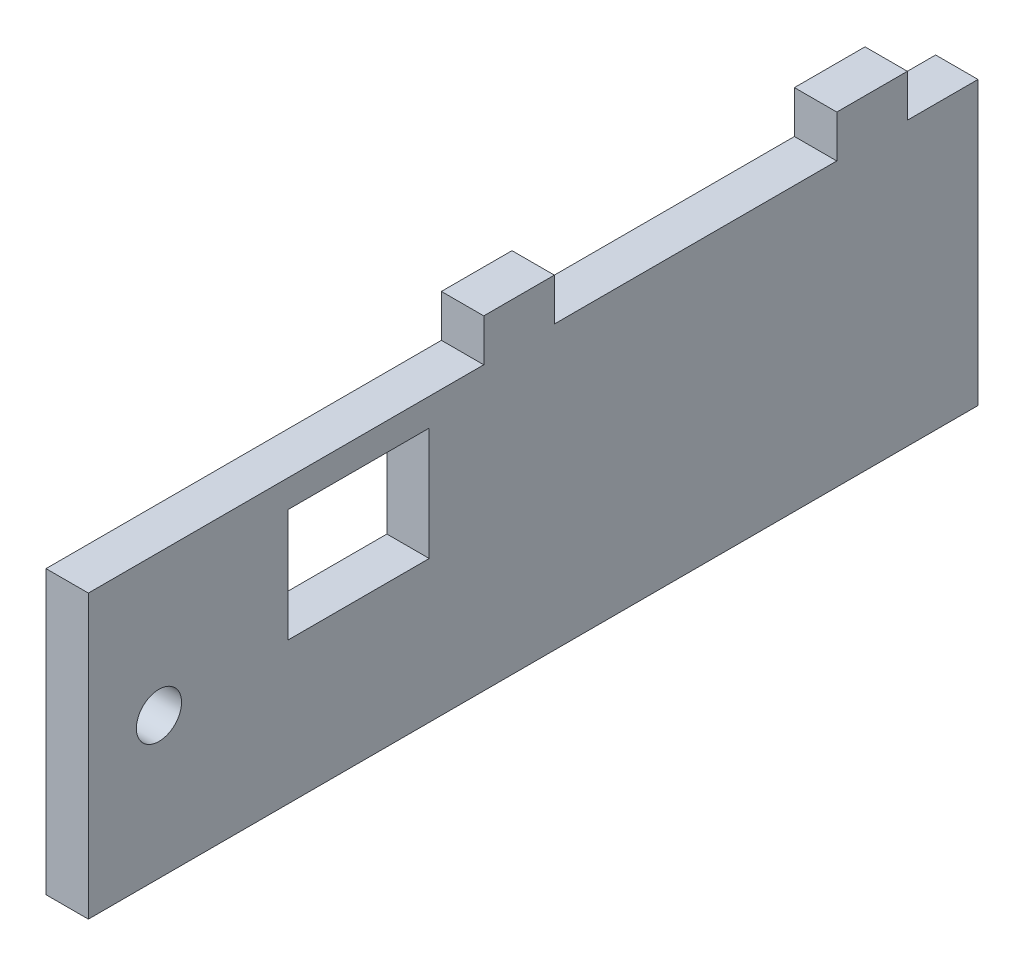
ISO-10303-21;
HEADER;
FILE_DESCRIPTION(('STEP AP214'),'2;1');
FILE_NAME('part.step','',(''),(''),'','','');
FILE_SCHEMA(('AUTOMOTIVE_DESIGN { 1 0 10303 214 1 1 1 1 }'));
ENDSEC;
DATA;
#1=APPLICATION_CONTEXT('core data for automotive mechanical design processes');
#2=APPLICATION_PROTOCOL_DEFINITION('international standard','automotive_design',2000,#1);
#3=PRODUCT_CONTEXT('',#1,'mechanical');
#4=PRODUCT('Part','Part','',(#3));
#5=PRODUCT_RELATED_PRODUCT_CATEGORY('part','',(#4));
#6=PRODUCT_DEFINITION_FORMATION('','',#4);
#7=PRODUCT_DEFINITION_CONTEXT('part definition',#1,'design');
#8=PRODUCT_DEFINITION('design','',#6,#7);
#9=PRODUCT_DEFINITION_SHAPE('','',#8);
#10=(LENGTH_UNIT() NAMED_UNIT(*) SI_UNIT(.MILLI.,.METRE.));
#11=(NAMED_UNIT(*) PLANE_ANGLE_UNIT() SI_UNIT($,.RADIAN.));
#12=(NAMED_UNIT(*) SI_UNIT($,.STERADIAN.) SOLID_ANGLE_UNIT());
#13=UNCERTAINTY_MEASURE_WITH_UNIT(LENGTH_MEASURE(1.E-05),#10,'distance_accuracy_value','');
#14=(GEOMETRIC_REPRESENTATION_CONTEXT(3) GLOBAL_UNCERTAINTY_ASSIGNED_CONTEXT((#13)) GLOBAL_UNIT_ASSIGNED_CONTEXT((#10,
#11,#12)) REPRESENTATION_CONTEXT('',''));
#15=CARTESIAN_POINT('',(0.,0.,0.));
#16=DIRECTION('',(0.,0.,1.));
#17=DIRECTION('',(1.,0.,0.));
#18=AXIS2_PLACEMENT_3D('',#15,#16,#17);
#19=CARTESIAN_POINT('',(3.,0.,0.));
#20=DIRECTION('',(-1.,0.,0.));
#21=DIRECTION('',(0.,0.,1.));
#22=AXIS2_PLACEMENT_3D('',#19,#20,#21);
#23=PLANE('',#22);
#24=CARTESIAN_POINT('',(3.,17.,-21.9999999999995));
#25=DIRECTION('',(1.,0.,0.));
#26=DIRECTION('',(0.,0.,-1.));
#27=AXIS2_PLACEMENT_3D('',#24,#25,#26);
#28=CIRCLE('',#27,1.59999999999971);
#29=CARTESIAN_POINT('',(3.,17.,-23.5999999999993));
#30=VERTEX_POINT('',#29);
#31=EDGE_CURVE('E182',#30,#30,#28,.T.);
#32=ORIENTED_EDGE('',*,*,#31,.F.);
#33=EDGE_LOOP('',(#32));
#34=FACE_BOUND('',#33,.T.);
#35=DIRECTION('',(0.,0.,-1.));
#36=VECTOR('',#35,1.);
#37=CARTESIAN_POINT('',(3.,7.,-17.));
#38=LINE('',#37,#36);
#39=CARTESIAN_POINT('',(3.,7.,-17.));
#40=VERTEX_POINT('',#39);
#41=CARTESIAN_POINT('',(3.,7.,-80.));
#42=VERTEX_POINT('',#41);
#43=EDGE_CURVE('E188',#40,#42,#38,.T.);
#44=ORIENTED_EDGE('',*,*,#43,.T.);
#45=DIRECTION('',(0.,1.,0.));
#46=VECTOR('',#45,1.);
#47=CARTESIAN_POINT('',(3.,27.,-80.));
#48=LINE('',#47,#46);
#49=CARTESIAN_POINT('',(3.,27.,-80.));
#50=VERTEX_POINT('',#49);
#51=EDGE_CURVE('E191',#42,#50,#48,.T.);
#52=ORIENTED_EDGE('',*,*,#51,.T.);
#53=DIRECTION('',(0.,0.,1.));
#54=VECTOR('',#53,1.);
#55=CARTESIAN_POINT('',(3.,27.,-75.));
#56=LINE('',#55,#54);
#57=CARTESIAN_POINT('',(3.,27.,-75.));
#58=VERTEX_POINT('',#57);
#59=EDGE_CURVE('E194',#50,#58,#56,.T.);
#60=ORIENTED_EDGE('',*,*,#59,.T.);
#61=DIRECTION('',(0.,1.,0.));
#62=VECTOR('',#61,1.);
#63=CARTESIAN_POINT('',(3.,30.,-75.));
#64=LINE('',#63,#62);
#65=CARTESIAN_POINT('',(3.,30.,-75.));
#66=VERTEX_POINT('',#65);
#67=EDGE_CURVE('E196',#58,#66,#64,.T.);
#68=ORIENTED_EDGE('',*,*,#67,.T.);
#69=DIRECTION('',(0.,0.,1.));
#70=VECTOR('',#69,1.);
#71=CARTESIAN_POINT('',(3.,30.,-70.));
#72=LINE('',#71,#70);
#73=CARTESIAN_POINT('',(3.,30.,-70.));
#74=VERTEX_POINT('',#73);
#75=EDGE_CURVE('E198',#66,#74,#72,.T.);
#76=ORIENTED_EDGE('',*,*,#75,.T.);
#77=DIRECTION('',(0.,-1.,0.));
#78=VECTOR('',#77,1.);
#79=CARTESIAN_POINT('',(3.,27.,-70.));
#80=LINE('',#79,#78);
#81=CARTESIAN_POINT('',(3.,27.,-70.));
#82=VERTEX_POINT('',#81);
#83=EDGE_CURVE('E200',#74,#82,#80,.T.);
#84=ORIENTED_EDGE('',*,*,#83,.T.);
#85=DIRECTION('',(0.,0.,1.));
#86=VECTOR('',#85,1.);
#87=CARTESIAN_POINT('',(3.,27.,-50.));
#88=LINE('',#87,#86);
#89=CARTESIAN_POINT('',(3.,27.,-50.));
#90=VERTEX_POINT('',#89);
#91=EDGE_CURVE('E202',#82,#90,#88,.T.);
#92=ORIENTED_EDGE('',*,*,#91,.T.);
#93=DIRECTION('',(0.,1.,0.));
#94=VECTOR('',#93,1.);
#95=CARTESIAN_POINT('',(3.,30.,-50.));
#96=LINE('',#95,#94);
#97=CARTESIAN_POINT('',(3.,30.,-50.));
#98=VERTEX_POINT('',#97);
#99=EDGE_CURVE('E204',#90,#98,#96,.T.);
#100=ORIENTED_EDGE('',*,*,#99,.T.);
#101=DIRECTION('',(0.,0.,1.));
#102=VECTOR('',#101,1.);
#103=CARTESIAN_POINT('',(3.,30.,-45.));
#104=LINE('',#103,#102);
#105=CARTESIAN_POINT('',(3.,30.,-45.));
#106=VERTEX_POINT('',#105);
#107=EDGE_CURVE('E206',#98,#106,#104,.T.);
#108=ORIENTED_EDGE('',*,*,#107,.T.);
#109=DIRECTION('',(0.,-1.,0.));
#110=VECTOR('',#109,1.);
#111=CARTESIAN_POINT('',(3.,27.,-45.));
#112=LINE('',#111,#110);
#113=CARTESIAN_POINT('',(3.,27.,-45.));
#114=VERTEX_POINT('',#113);
#115=EDGE_CURVE('E208',#106,#114,#112,.T.);
#116=ORIENTED_EDGE('',*,*,#115,.T.);
#117=DIRECTION('',(0.,0.,1.));
#118=VECTOR('',#117,1.);
#119=CARTESIAN_POINT('',(3.,27.,-17.));
#120=LINE('',#119,#118);
#121=CARTESIAN_POINT('',(3.,27.,-17.));
#122=VERTEX_POINT('',#121);
#123=EDGE_CURVE('E210',#114,#122,#120,.T.);
#124=ORIENTED_EDGE('',*,*,#123,.T.);
#125=DIRECTION('',(0.,-1.,0.));
#126=VECTOR('',#125,1.);
#127=CARTESIAN_POINT('',(3.,27.,-17.));
#128=LINE('',#127,#126);
#129=EDGE_CURVE('E212',#122,#40,#128,.T.);
#130=ORIENTED_EDGE('',*,*,#129,.T.);
#131=EDGE_LOOP('',(#44,#52,#60,#68,#76,#84,#92,#100,#108,#116,#124,#130));
#132=FACE_BOUND('',#131,.T.);
#133=DIRECTION('',(0.,1.,0.));
#134=VECTOR('',#133,1.);
#135=CARTESIAN_POINT('',(3.,25.05,-41.1399999999998));
#136=LINE('',#135,#134);
#137=CARTESIAN_POINT('',(3.,17.05,-41.1399999999998));
#138=VERTEX_POINT('',#137);
#139=CARTESIAN_POINT('',(3.,25.05,-41.1399999999998));
#140=VERTEX_POINT('',#139);
#141=EDGE_CURVE('E146',#138,#140,#136,.T.);
#142=ORIENTED_EDGE('',*,*,#141,.F.);
#143=DIRECTION('',(0.,0.,-1.));
#144=VECTOR('',#143,1.);
#145=CARTESIAN_POINT('',(3.,17.05,-41.1399999999998));
#146=LINE('',#145,#144);
#147=CARTESIAN_POINT('',(3.,17.05,-31.1399999999998));
#148=VERTEX_POINT('',#147);
#149=EDGE_CURVE('E168',#148,#138,#146,.T.);
#150=ORIENTED_EDGE('',*,*,#149,.F.);
#151=DIRECTION('',(0.,-1.,0.));
#152=VECTOR('',#151,1.);
#153=CARTESIAN_POINT('',(3.,25.05,-31.1399999999998));
#154=LINE('',#153,#152);
#155=CARTESIAN_POINT('',(3.,25.05,-31.1399999999998));
#156=VERTEX_POINT('',#155);
#157=EDGE_CURVE('E166',#156,#148,#154,.T.);
#158=ORIENTED_EDGE('',*,*,#157,.F.);
#159=DIRECTION('',(0.,0.,1.));
#160=VECTOR('',#159,1.);
#161=CARTESIAN_POINT('',(3.,25.05,-41.1399999999998));
#162=LINE('',#161,#160);
#163=EDGE_CURVE('E154',#140,#156,#162,.T.);
#164=ORIENTED_EDGE('',*,*,#163,.F.);
#165=EDGE_LOOP('',(#142,#150,#158,#164));
#166=FACE_BOUND('',#165,.T.);
#167=ADVANCED_FACE('F33',(#34,#132,#166),#23,.F.);
#168=CARTESIAN_POINT('',(0.,0.,0.));
#169=DIRECTION('',(-1.,0.,0.));
#170=DIRECTION('',(0.,0.,1.));
#171=AXIS2_PLACEMENT_3D('',#168,#169,#170);
#172=PLANE('',#171);
#173=CARTESIAN_POINT('',(0.,17.,-21.9999999999995));
#174=DIRECTION('',(1.,0.,0.));
#175=DIRECTION('',(0.,0.,-1.));
#176=AXIS2_PLACEMENT_3D('',#173,#174,#175);
#177=CIRCLE('',#176,1.59999999999971);
#178=CARTESIAN_POINT('',(0.,17.,-23.5999999999993));
#179=VERTEX_POINT('',#178);
#180=EDGE_CURVE('E162',#179,#179,#177,.T.);
#181=ORIENTED_EDGE('',*,*,#180,.T.);
#182=EDGE_LOOP('',(#181));
#183=FACE_BOUND('',#182,.T.);
#184=DIRECTION('',(0.,0.,-1.));
#185=VECTOR('',#184,1.);
#186=CARTESIAN_POINT('',(0.,7.,-17.));
#187=LINE('',#186,#185);
#188=CARTESIAN_POINT('',(0.,7.,-17.));
#189=VERTEX_POINT('',#188);
#190=CARTESIAN_POINT('',(0.,7.,-80.));
#191=VERTEX_POINT('',#190);
#192=EDGE_CURVE('E185',#189,#191,#187,.T.);
#193=ORIENTED_EDGE('',*,*,#192,.F.);
#194=DIRECTION('',(0.,-1.,0.));
#195=VECTOR('',#194,1.);
#196=CARTESIAN_POINT('',(0.,27.,-17.));
#197=LINE('',#196,#195);
#198=CARTESIAN_POINT('',(0.,27.,-17.));
#199=VERTEX_POINT('',#198);
#200=EDGE_CURVE('E192',#199,#189,#197,.T.);
#201=ORIENTED_EDGE('',*,*,#200,.F.);
#202=DIRECTION('',(0.,0.,1.));
#203=VECTOR('',#202,1.);
#204=CARTESIAN_POINT('',(0.,27.,-17.));
#205=LINE('',#204,#203);
#206=CARTESIAN_POINT('',(0.,27.,-45.));
#207=VERTEX_POINT('',#206);
#208=EDGE_CURVE('E235',#207,#199,#205,.T.);
#209=ORIENTED_EDGE('',*,*,#208,.F.);
#210=DIRECTION('',(0.,-1.,0.));
#211=VECTOR('',#210,1.);
#212=CARTESIAN_POINT('',(0.,27.,-45.));
#213=LINE('',#212,#211);
#214=CARTESIAN_POINT('',(0.,30.,-45.));
#215=VERTEX_POINT('',#214);
#216=EDGE_CURVE('E233',#215,#207,#213,.T.);
#217=ORIENTED_EDGE('',*,*,#216,.F.);
#218=DIRECTION('',(0.,0.,1.));
#219=VECTOR('',#218,1.);
#220=CARTESIAN_POINT('',(0.,30.,-45.));
#221=LINE('',#220,#219);
#222=CARTESIAN_POINT('',(0.,30.,-50.));
#223=VERTEX_POINT('',#222);
#224=EDGE_CURVE('E231',#223,#215,#221,.T.);
#225=ORIENTED_EDGE('',*,*,#224,.F.);
#226=DIRECTION('',(0.,1.,0.));
#227=VECTOR('',#226,1.);
#228=CARTESIAN_POINT('',(0.,30.,-50.));
#229=LINE('',#228,#227);
#230=CARTESIAN_POINT('',(0.,27.,-50.));
#231=VERTEX_POINT('',#230);
#232=EDGE_CURVE('E229',#231,#223,#229,.T.);
#233=ORIENTED_EDGE('',*,*,#232,.F.);
#234=DIRECTION('',(0.,0.,1.));
#235=VECTOR('',#234,1.);
#236=CARTESIAN_POINT('',(0.,27.,-50.));
#237=LINE('',#236,#235);
#238=CARTESIAN_POINT('',(0.,27.,-70.));
#239=VERTEX_POINT('',#238);
#240=EDGE_CURVE('E227',#239,#231,#237,.T.);
#241=ORIENTED_EDGE('',*,*,#240,.F.);
#242=DIRECTION('',(0.,-1.,0.));
#243=VECTOR('',#242,1.);
#244=CARTESIAN_POINT('',(0.,27.,-70.));
#245=LINE('',#244,#243);
#246=CARTESIAN_POINT('',(0.,30.,-70.));
#247=VERTEX_POINT('',#246);
#248=EDGE_CURVE('E225',#247,#239,#245,.T.);
#249=ORIENTED_EDGE('',*,*,#248,.F.);
#250=DIRECTION('',(0.,0.,1.));
#251=VECTOR('',#250,1.);
#252=CARTESIAN_POINT('',(0.,30.,-70.));
#253=LINE('',#252,#251);
#254=CARTESIAN_POINT('',(0.,30.,-75.));
#255=VERTEX_POINT('',#254);
#256=EDGE_CURVE('E223',#255,#247,#253,.T.);
#257=ORIENTED_EDGE('',*,*,#256,.F.);
#258=DIRECTION('',(0.,1.,0.));
#259=VECTOR('',#258,1.);
#260=CARTESIAN_POINT('',(0.,30.,-75.));
#261=LINE('',#260,#259);
#262=CARTESIAN_POINT('',(0.,27.,-75.));
#263=VERTEX_POINT('',#262);
#264=EDGE_CURVE('E221',#263,#255,#261,.T.);
#265=ORIENTED_EDGE('',*,*,#264,.F.);
#266=DIRECTION('',(0.,0.,1.));
#267=VECTOR('',#266,1.);
#268=CARTESIAN_POINT('',(0.,27.,-75.));
#269=LINE('',#268,#267);
#270=CARTESIAN_POINT('',(0.,27.,-80.));
#271=VERTEX_POINT('',#270);
#272=EDGE_CURVE('E219',#271,#263,#269,.T.);
#273=ORIENTED_EDGE('',*,*,#272,.F.);
#274=DIRECTION('',(0.,1.,0.));
#275=VECTOR('',#274,1.);
#276=CARTESIAN_POINT('',(0.,27.,-80.));
#277=LINE('',#276,#275);
#278=EDGE_CURVE('E217',#191,#271,#277,.T.);
#279=ORIENTED_EDGE('',*,*,#278,.F.);
#280=EDGE_LOOP('',(#193,#201,#209,#217,#225,#233,#241,#249,#257,#265,#273,#279));
#281=FACE_BOUND('',#280,.T.);
#282=DIRECTION('',(0.,0.,-1.));
#283=VECTOR('',#282,1.);
#284=CARTESIAN_POINT('',(0.,17.05,-41.1399999999998));
#285=LINE('',#284,#283);
#286=CARTESIAN_POINT('',(0.,17.05,-31.1399999999998));
#287=VERTEX_POINT('',#286);
#288=CARTESIAN_POINT('',(0.,17.05,-41.1399999999998));
#289=VERTEX_POINT('',#288);
#290=EDGE_CURVE('E155',#287,#289,#285,.T.);
#291=ORIENTED_EDGE('',*,*,#290,.T.);
#292=DIRECTION('',(0.,1.,0.));
#293=VECTOR('',#292,1.);
#294=CARTESIAN_POINT('',(0.,25.05,-41.1399999999998));
#295=LINE('',#294,#293);
#296=CARTESIAN_POINT('',(0.,25.05,-41.1399999999998));
#297=VERTEX_POINT('',#296);
#298=EDGE_CURVE('E56',#289,#297,#295,.T.);
#299=ORIENTED_EDGE('',*,*,#298,.T.);
#300=DIRECTION('',(0.,0.,1.));
#301=VECTOR('',#300,1.);
#302=CARTESIAN_POINT('',(0.,25.05,-41.1399999999998));
#303=LINE('',#302,#301);
#304=CARTESIAN_POINT('',(0.,25.05,-31.1399999999998));
#305=VERTEX_POINT('',#304);
#306=EDGE_CURVE('E161',#297,#305,#303,.T.);
#307=ORIENTED_EDGE('',*,*,#306,.T.);
#308=DIRECTION('',(0.,-1.,0.));
#309=VECTOR('',#308,1.);
#310=CARTESIAN_POINT('',(0.,25.05,-31.1399999999998));
#311=LINE('',#310,#309);
#312=EDGE_CURVE('E174',#305,#287,#311,.T.);
#313=ORIENTED_EDGE('',*,*,#312,.T.);
#314=EDGE_LOOP('',(#291,#299,#307,#313));
#315=FACE_BOUND('',#314,.T.);
#316=ADVANCED_FACE('F277',(#183,#281,#315),#172,.T.);
#317=CARTESIAN_POINT('',(3.,7.,-17.));
#318=DIRECTION('',(0.,1.,0.));
#319=DIRECTION('',(0.,0.,1.));
#320=AXIS2_PLACEMENT_3D('',#317,#318,#319);
#321=PLANE('',#320);
#322=ORIENTED_EDGE('',*,*,#192,.T.);
#323=DIRECTION('',(-1.,0.,0.));
#324=VECTOR('',#323,1.);
#325=CARTESIAN_POINT('',(3.,7.,-80.));
#326=LINE('',#325,#324);
#327=EDGE_CURVE('E11',#42,#191,#326,.T.);
#328=ORIENTED_EDGE('',*,*,#327,.F.);
#329=ORIENTED_EDGE('',*,*,#43,.F.);
#330=DIRECTION('',(-1.,0.,0.));
#331=VECTOR('',#330,1.);
#332=CARTESIAN_POINT('',(3.,7.,-17.));
#333=LINE('',#332,#331);
#334=EDGE_CURVE('E214',#40,#189,#333,.T.);
#335=ORIENTED_EDGE('',*,*,#334,.T.);
#336=EDGE_LOOP('',(#322,#328,#329,#335));
#337=FACE_BOUND('',#336,.T.);
#338=ADVANCED_FACE('F35',(#337),#321,.F.);
#339=CARTESIAN_POINT('',(3.,27.,-80.));
#340=DIRECTION('',(0.,0.,1.));
#341=DIRECTION('',(1.,0.,0.));
#342=AXIS2_PLACEMENT_3D('',#339,#340,#341);
#343=PLANE('',#342);
#344=ORIENTED_EDGE('',*,*,#278,.T.);
#345=DIRECTION('',(-1.,0.,0.));
#346=VECTOR('',#345,1.);
#347=CARTESIAN_POINT('',(3.,27.,-80.));
#348=LINE('',#347,#346);
#349=EDGE_CURVE('E41',#50,#271,#348,.T.);
#350=ORIENTED_EDGE('',*,*,#349,.F.);
#351=ORIENTED_EDGE('',*,*,#51,.F.);
#352=ORIENTED_EDGE('',*,*,#327,.T.);
#353=EDGE_LOOP('',(#344,#350,#351,#352));
#354=FACE_BOUND('',#353,.T.);
#355=ADVANCED_FACE('F294',(#354),#343,.F.);
#356=CARTESIAN_POINT('',(3.,27.,-75.));
#357=DIRECTION('',(0.,-1.,0.));
#358=DIRECTION('',(0.,0.,-1.));
#359=AXIS2_PLACEMENT_3D('',#356,#357,#358);
#360=PLANE('',#359);
#361=ORIENTED_EDGE('',*,*,#272,.T.);
#362=DIRECTION('',(-1.,0.,0.));
#363=VECTOR('',#362,1.);
#364=CARTESIAN_POINT('',(3.,27.,-75.));
#365=LINE('',#364,#363);
#366=EDGE_CURVE('E264',#58,#263,#365,.T.);
#367=ORIENTED_EDGE('',*,*,#366,.F.);
#368=ORIENTED_EDGE('',*,*,#59,.F.);
#369=ORIENTED_EDGE('',*,*,#349,.T.);
#370=EDGE_LOOP('',(#361,#367,#368,#369));
#371=FACE_BOUND('',#370,.T.);
#372=ADVANCED_FACE('F271',(#371),#360,.F.);
#373=CARTESIAN_POINT('',(3.,30.,-75.));
#374=DIRECTION('',(0.,0.,1.));
#375=DIRECTION('',(1.,0.,0.));
#376=AXIS2_PLACEMENT_3D('',#373,#374,#375);
#377=PLANE('',#376);
#378=ORIENTED_EDGE('',*,*,#264,.T.);
#379=DIRECTION('',(-1.,0.,0.));
#380=VECTOR('',#379,1.);
#381=CARTESIAN_POINT('',(3.,30.,-75.));
#382=LINE('',#381,#380);
#383=EDGE_CURVE('E261',#66,#255,#382,.T.);
#384=ORIENTED_EDGE('',*,*,#383,.F.);
#385=ORIENTED_EDGE('',*,*,#67,.F.);
#386=ORIENTED_EDGE('',*,*,#366,.T.);
#387=EDGE_LOOP('',(#378,#384,#385,#386));
#388=FACE_BOUND('',#387,.T.);
#389=ADVANCED_FACE('F283',(#388),#377,.F.);
#390=CARTESIAN_POINT('',(3.,30.,-70.));
#391=DIRECTION('',(0.,-1.,0.));
#392=DIRECTION('',(0.,0.,-1.));
#393=AXIS2_PLACEMENT_3D('',#390,#391,#392);
#394=PLANE('',#393);
#395=ORIENTED_EDGE('',*,*,#256,.T.);
#396=DIRECTION('',(-1.,0.,0.));
#397=VECTOR('',#396,1.);
#398=CARTESIAN_POINT('',(3.,30.,-70.));
#399=LINE('',#398,#397);
#400=EDGE_CURVE('E258',#74,#247,#399,.T.);
#401=ORIENTED_EDGE('',*,*,#400,.F.);
#402=ORIENTED_EDGE('',*,*,#75,.F.);
#403=ORIENTED_EDGE('',*,*,#383,.T.);
#404=EDGE_LOOP('',(#395,#401,#402,#403));
#405=FACE_BOUND('',#404,.T.);
#406=ADVANCED_FACE('F287',(#405),#394,.F.);
#407=CARTESIAN_POINT('',(3.,27.,-70.));
#408=DIRECTION('',(0.,0.,-1.));
#409=DIRECTION('',(-1.,0.,0.));
#410=AXIS2_PLACEMENT_3D('',#407,#408,#409);
#411=PLANE('',#410);
#412=ORIENTED_EDGE('',*,*,#248,.T.);
#413=DIRECTION('',(-1.,0.,0.));
#414=VECTOR('',#413,1.);
#415=CARTESIAN_POINT('',(3.,27.,-70.));
#416=LINE('',#415,#414);
#417=EDGE_CURVE('E255',#82,#239,#416,.T.);
#418=ORIENTED_EDGE('',*,*,#417,.F.);
#419=ORIENTED_EDGE('',*,*,#83,.F.);
#420=ORIENTED_EDGE('',*,*,#400,.T.);
#421=EDGE_LOOP('',(#412,#418,#419,#420));
#422=FACE_BOUND('',#421,.T.);
#423=ADVANCED_FACE('F327',(#422),#411,.F.);
#424=CARTESIAN_POINT('',(3.,27.,-50.));
#425=DIRECTION('',(0.,-1.,0.));
#426=DIRECTION('',(0.,0.,-1.));
#427=AXIS2_PLACEMENT_3D('',#424,#425,#426);
#428=PLANE('',#427);
#429=ORIENTED_EDGE('',*,*,#240,.T.);
#430=DIRECTION('',(-1.,0.,0.));
#431=VECTOR('',#430,1.);
#432=CARTESIAN_POINT('',(3.,27.,-50.));
#433=LINE('',#432,#431);
#434=EDGE_CURVE('E252',#90,#231,#433,.T.);
#435=ORIENTED_EDGE('',*,*,#434,.F.);
#436=ORIENTED_EDGE('',*,*,#91,.F.);
#437=ORIENTED_EDGE('',*,*,#417,.T.);
#438=EDGE_LOOP('',(#429,#435,#436,#437));
#439=FACE_BOUND('',#438,.T.);
#440=ADVANCED_FACE('F325',(#439),#428,.F.);
#441=CARTESIAN_POINT('',(3.,30.,-50.));
#442=DIRECTION('',(0.,0.,1.));
#443=DIRECTION('',(1.,0.,0.));
#444=AXIS2_PLACEMENT_3D('',#441,#442,#443);
#445=PLANE('',#444);
#446=ORIENTED_EDGE('',*,*,#232,.T.);
#447=DIRECTION('',(-1.,0.,0.));
#448=VECTOR('',#447,1.);
#449=CARTESIAN_POINT('',(3.,30.,-50.));
#450=LINE('',#449,#448);
#451=EDGE_CURVE('E249',#98,#223,#450,.T.);
#452=ORIENTED_EDGE('',*,*,#451,.F.);
#453=ORIENTED_EDGE('',*,*,#99,.F.);
#454=ORIENTED_EDGE('',*,*,#434,.T.);
#455=EDGE_LOOP('',(#446,#452,#453,#454));
#456=FACE_BOUND('',#455,.T.);
#457=ADVANCED_FACE('F321',(#456),#445,.F.);
#458=CARTESIAN_POINT('',(3.,30.,-45.));
#459=DIRECTION('',(0.,-1.,0.));
#460=DIRECTION('',(0.,0.,-1.));
#461=AXIS2_PLACEMENT_3D('',#458,#459,#460);
#462=PLANE('',#461);
#463=ORIENTED_EDGE('',*,*,#224,.T.);
#464=DIRECTION('',(-1.,0.,0.));
#465=VECTOR('',#464,1.);
#466=CARTESIAN_POINT('',(3.,30.,-45.));
#467=LINE('',#466,#465);
#468=EDGE_CURVE('E246',#106,#215,#467,.T.);
#469=ORIENTED_EDGE('',*,*,#468,.F.);
#470=ORIENTED_EDGE('',*,*,#107,.F.);
#471=ORIENTED_EDGE('',*,*,#451,.T.);
#472=EDGE_LOOP('',(#463,#469,#470,#471));
#473=FACE_BOUND('',#472,.T.);
#474=ADVANCED_FACE('F316',(#473),#462,.F.);
#475=CARTESIAN_POINT('',(3.,27.,-45.));
#476=DIRECTION('',(0.,0.,-1.));
#477=DIRECTION('',(-1.,0.,0.));
#478=AXIS2_PLACEMENT_3D('',#475,#476,#477);
#479=PLANE('',#478);
#480=ORIENTED_EDGE('',*,*,#216,.T.);
#481=DIRECTION('',(-1.,0.,0.));
#482=VECTOR('',#481,1.);
#483=CARTESIAN_POINT('',(3.,27.,-45.));
#484=LINE('',#483,#482);
#485=EDGE_CURVE('E243',#114,#207,#484,.T.);
#486=ORIENTED_EDGE('',*,*,#485,.F.);
#487=ORIENTED_EDGE('',*,*,#115,.F.);
#488=ORIENTED_EDGE('',*,*,#468,.T.);
#489=EDGE_LOOP('',(#480,#486,#487,#488));
#490=FACE_BOUND('',#489,.T.);
#491=ADVANCED_FACE('F310',(#490),#479,.F.);
#492=CARTESIAN_POINT('',(3.,27.,-17.));
#493=DIRECTION('',(0.,-1.,0.));
#494=DIRECTION('',(0.,0.,-1.));
#495=AXIS2_PLACEMENT_3D('',#492,#493,#494);
#496=PLANE('',#495);
#497=ORIENTED_EDGE('',*,*,#208,.T.);
#498=DIRECTION('',(-1.,0.,0.));
#499=VECTOR('',#498,1.);
#500=CARTESIAN_POINT('',(3.,27.,-17.));
#501=LINE('',#500,#499);
#502=EDGE_CURVE('E240',#122,#199,#501,.T.);
#503=ORIENTED_EDGE('',*,*,#502,.F.);
#504=ORIENTED_EDGE('',*,*,#123,.F.);
#505=ORIENTED_EDGE('',*,*,#485,.T.);
#506=EDGE_LOOP('',(#497,#503,#504,#505));
#507=FACE_BOUND('',#506,.T.);
#508=ADVANCED_FACE('F306',(#507),#496,.F.);
#509=CARTESIAN_POINT('',(3.,27.,-17.));
#510=DIRECTION('',(0.,0.,-1.));
#511=DIRECTION('',(0.,1.,0.));
#512=AXIS2_PLACEMENT_3D('',#509,#510,#511);
#513=PLANE('',#512);
#514=ORIENTED_EDGE('',*,*,#200,.T.);
#515=ORIENTED_EDGE('',*,*,#334,.F.);
#516=ORIENTED_EDGE('',*,*,#129,.F.);
#517=ORIENTED_EDGE('',*,*,#502,.T.);
#518=EDGE_LOOP('',(#514,#515,#516,#517));
#519=FACE_BOUND('',#518,.T.);
#520=ADVANCED_FACE('F301',(#519),#513,.F.);
#521=CARTESIAN_POINT('',(3.,17.,-21.9999999999995));
#522=DIRECTION('',(-1.,0.,0.));
#523=DIRECTION('',(0.,0.,1.));
#524=AXIS2_PLACEMENT_3D('',#521,#522,#523);
#525=CYLINDRICAL_SURFACE('',#524,1.59999999999971);
#526=ORIENTED_EDGE('',*,*,#31,.T.);
#527=EDGE_LOOP('',(#526));
#528=FACE_BOUND('',#527,.T.);
#529=ORIENTED_EDGE('',*,*,#180,.F.);
#530=EDGE_LOOP('',(#529));
#531=FACE_BOUND('',#530,.T.);
#532=ADVANCED_FACE('F346',(#528,#531),#525,.F.);
#533=CARTESIAN_POINT('',(3.,25.05,-41.1399999999998));
#534=DIRECTION('',(0.,0.,1.));
#535=DIRECTION('',(1.,0.,0.));
#536=AXIS2_PLACEMENT_3D('',#533,#534,#535);
#537=PLANE('',#536);
#538=ORIENTED_EDGE('',*,*,#298,.F.);
#539=DIRECTION('',(-1.,0.,0.));
#540=VECTOR('',#539,1.);
#541=CARTESIAN_POINT('',(3.,17.05,-41.1399999999998));
#542=LINE('',#541,#540);
#543=EDGE_CURVE('E150',#138,#289,#542,.T.);
#544=ORIENTED_EDGE('',*,*,#543,.F.);
#545=ORIENTED_EDGE('',*,*,#141,.T.);
#546=DIRECTION('',(-1.,0.,0.));
#547=VECTOR('',#546,1.);
#548=CARTESIAN_POINT('',(3.,25.05,-41.1399999999998));
#549=LINE('',#548,#547);
#550=EDGE_CURVE('E149',#140,#297,#549,.T.);
#551=ORIENTED_EDGE('',*,*,#550,.T.);
#552=EDGE_LOOP('',(#538,#544,#545,#551));
#553=FACE_BOUND('',#552,.T.);
#554=ADVANCED_FACE('F148',(#553),#537,.T.);
#555=CARTESIAN_POINT('',(3.,25.05,-41.1399999999998));
#556=DIRECTION('',(0.,-1.,0.));
#557=DIRECTION('',(0.,0.,-1.));
#558=AXIS2_PLACEMENT_3D('',#555,#556,#557);
#559=PLANE('',#558);
#560=ORIENTED_EDGE('',*,*,#306,.F.);
#561=ORIENTED_EDGE('',*,*,#550,.F.);
#562=ORIENTED_EDGE('',*,*,#163,.T.);
#563=DIRECTION('',(-1.,0.,0.));
#564=VECTOR('',#563,1.);
#565=CARTESIAN_POINT('',(3.,25.05,-31.1399999999998));
#566=LINE('',#565,#564);
#567=EDGE_CURVE('E163',#156,#305,#566,.T.);
#568=ORIENTED_EDGE('',*,*,#567,.T.);
#569=EDGE_LOOP('',(#560,#561,#562,#568));
#570=FACE_BOUND('',#569,.T.);
#571=ADVANCED_FACE('F158',(#570),#559,.T.);
#572=CARTESIAN_POINT('',(3.,25.05,-31.1399999999998));
#573=DIRECTION('',(0.,0.,-1.));
#574=DIRECTION('',(0.,1.,0.));
#575=AXIS2_PLACEMENT_3D('',#572,#573,#574);
#576=PLANE('',#575);
#577=ORIENTED_EDGE('',*,*,#312,.F.);
#578=ORIENTED_EDGE('',*,*,#567,.F.);
#579=ORIENTED_EDGE('',*,*,#157,.T.);
#580=DIRECTION('',(-1.,0.,0.));
#581=VECTOR('',#580,1.);
#582=CARTESIAN_POINT('',(3.,17.05,-31.1399999999998));
#583=LINE('',#582,#581);
#584=EDGE_CURVE('E48',#148,#287,#583,.T.);
#585=ORIENTED_EDGE('',*,*,#584,.T.);
#586=EDGE_LOOP('',(#577,#578,#579,#585));
#587=FACE_BOUND('',#586,.T.);
#588=ADVANCED_FACE('F395',(#587),#576,.T.);
#589=CARTESIAN_POINT('',(3.,17.05,-41.1399999999998));
#590=DIRECTION('',(0.,1.,0.));
#591=DIRECTION('',(0.,0.,1.));
#592=AXIS2_PLACEMENT_3D('',#589,#590,#591);
#593=PLANE('',#592);
#594=ORIENTED_EDGE('',*,*,#290,.F.);
#595=ORIENTED_EDGE('',*,*,#584,.F.);
#596=ORIENTED_EDGE('',*,*,#149,.T.);
#597=ORIENTED_EDGE('',*,*,#543,.T.);
#598=EDGE_LOOP('',(#594,#595,#596,#597));
#599=FACE_BOUND('',#598,.T.);
#600=ADVANCED_FACE('F402',(#599),#593,.T.);
#601=CLOSED_SHELL('',(#167,#316,#338,#355,#372,#389,#406,#423,#440,#457,#474,#491,#508,#520,
#532,#554,#571,#588,#600));
#602=MANIFOLD_SOLID_BREP('B2',#601);
#603=ADVANCED_BREP_SHAPE_REPRESENTATION('',(#18,#602),#14);
#604=SHAPE_DEFINITION_REPRESENTATION(#9,#603);
ENDSEC;
END-ISO-10303-21;
